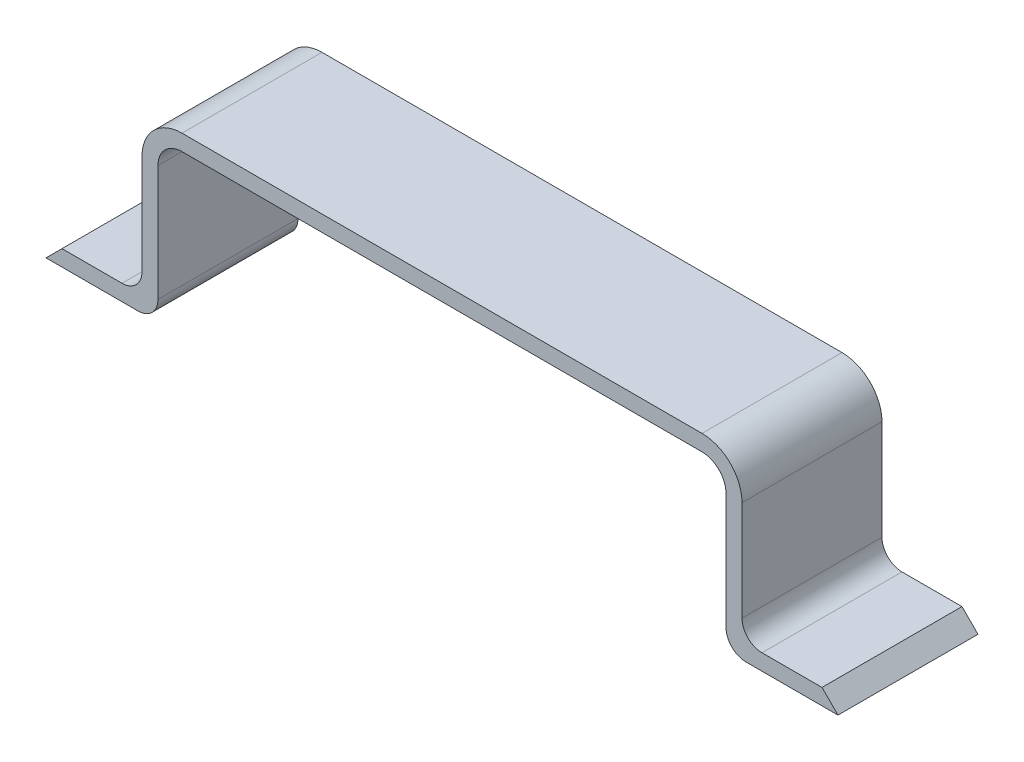
ISO-10303-21;
HEADER;
FILE_DESCRIPTION(('STEP AP214'),'2;1');
FILE_NAME('part.step','',(''),(''),'','','');
FILE_SCHEMA(('AUTOMOTIVE_DESIGN { 1 0 10303 214 1 1 1 1 }'));
ENDSEC;
DATA;
#1=APPLICATION_CONTEXT('core data for automotive mechanical design processes');
#2=APPLICATION_PROTOCOL_DEFINITION('international standard','automotive_design',2000,#1);
#3=PRODUCT_CONTEXT('',#1,'mechanical');
#4=PRODUCT('Part','Part','',(#3));
#5=PRODUCT_RELATED_PRODUCT_CATEGORY('part','',(#4));
#6=PRODUCT_DEFINITION_FORMATION('','',#4);
#7=PRODUCT_DEFINITION_CONTEXT('part definition',#1,'design');
#8=PRODUCT_DEFINITION('design','',#6,#7);
#9=PRODUCT_DEFINITION_SHAPE('','',#8);
#10=(LENGTH_UNIT() NAMED_UNIT(*) SI_UNIT(.MILLI.,.METRE.));
#11=(NAMED_UNIT(*) PLANE_ANGLE_UNIT() SI_UNIT($,.RADIAN.));
#12=(NAMED_UNIT(*) SI_UNIT($,.STERADIAN.) SOLID_ANGLE_UNIT());
#13=UNCERTAINTY_MEASURE_WITH_UNIT(LENGTH_MEASURE(1.E-05),#10,'distance_accuracy_value','');
#14=(GEOMETRIC_REPRESENTATION_CONTEXT(3) GLOBAL_UNCERTAINTY_ASSIGNED_CONTEXT((#13)) GLOBAL_UNIT_ASSIGNED_CONTEXT((#10,
#11,#12)) REPRESENTATION_CONTEXT('',''));
#15=CARTESIAN_POINT('',(0.,0.,0.));
#16=DIRECTION('',(0.,0.,1.));
#17=DIRECTION('',(1.,0.,0.));
#18=AXIS2_PLACEMENT_3D('',#15,#16,#17);
#19=CARTESIAN_POINT('',(-100.,-4.,17.5));
#20=DIRECTION('',(0.,1.,0.));
#21=DIRECTION('',(0.,0.,1.));
#22=AXIS2_PLACEMENT_3D('',#19,#20,#21);
#23=PLANE('',#22);
#24=DIRECTION('',(1.,0.,0.));
#25=VECTOR('',#24,1.);
#26=CARTESIAN_POINT('',(-100.,-4.,17.5));
#27=LINE('',#26,#25);
#28=CARTESIAN_POINT('',(-98.9999999999999,-4.,17.5));
#29=VERTEX_POINT('',#28);
#30=CARTESIAN_POINT('',(-76.,-4.,17.5));
#31=VERTEX_POINT('',#30);
#32=EDGE_CURVE('E170',#29,#31,#27,.T.);
#33=ORIENTED_EDGE('',*,*,#32,.F.);
#34=DIRECTION('',(0.,0.,1.));
#35=VECTOR('',#34,1.);
#36=CARTESIAN_POINT('',(-98.9999999999999,-4.,17.5));
#37=LINE('',#36,#35);
#38=CARTESIAN_POINT('',(-98.9999999999999,-4.,-17.5));
#39=VERTEX_POINT('',#38);
#40=EDGE_CURVE('E188',#29,#39,#37,.F.);
#41=ORIENTED_EDGE('',*,*,#40,.T.);
#42=DIRECTION('',(1.,0.,0.));
#43=VECTOR('',#42,1.);
#44=CARTESIAN_POINT('',(-100.,-4.,-17.5));
#45=LINE('',#44,#43);
#46=CARTESIAN_POINT('',(-76.,-4.,-17.5));
#47=VERTEX_POINT('',#46);
#48=EDGE_CURVE('E185',#39,#47,#45,.T.);
#49=ORIENTED_EDGE('',*,*,#48,.T.);
#50=DIRECTION('',(0.,0.,-1.));
#51=VECTOR('',#50,1.);
#52=CARTESIAN_POINT('',(-76.,-4.,17.5));
#53=LINE('',#52,#51);
#54=EDGE_CURVE('E183',#31,#47,#53,.T.);
#55=ORIENTED_EDGE('',*,*,#54,.F.);
#56=EDGE_LOOP('',(#33,#41,#49,#55));
#57=FACE_BOUND('',#56,.T.);
#58=ADVANCED_FACE('F34',(#57),#23,.F.);
#59=CARTESIAN_POINT('',(-76.,0.999999999999999,17.5));
#60=DIRECTION('',(0.,0.,-1.));
#61=DIRECTION('',(-1.,0.,0.));
#62=AXIS2_PLACEMENT_3D('',#59,#60,#61);
#63=CYLINDRICAL_SURFACE('',#62,5.);
#64=CARTESIAN_POINT('',(-76.,0.999999999999999,-17.5));
#65=DIRECTION('',(0.,0.,1.));
#66=DIRECTION('',(1.,0.,0.));
#67=AXIS2_PLACEMENT_3D('',#64,#65,#66);
#68=CIRCLE('',#67,5.);
#69=CARTESIAN_POINT('',(-71.,1.00000000000004,-17.5));
#70=VERTEX_POINT('',#69);
#71=EDGE_CURVE('E230',#47,#70,#68,.T.);
#72=ORIENTED_EDGE('',*,*,#71,.T.);
#73=DIRECTION('',(0.,0.,-1.));
#74=VECTOR('',#73,1.);
#75=CARTESIAN_POINT('',(-71.,1.00000000000004,17.5));
#76=LINE('',#75,#74);
#77=CARTESIAN_POINT('',(-71.,1.00000000000004,17.5));
#78=VERTEX_POINT('',#77);
#79=EDGE_CURVE('E189',#78,#70,#76,.T.);
#80=ORIENTED_EDGE('',*,*,#79,.F.);
#81=CARTESIAN_POINT('',(-76.,0.999999999999999,17.5));
#82=DIRECTION('',(0.,0.,1.));
#83=DIRECTION('',(1.,0.,0.));
#84=AXIS2_PLACEMENT_3D('',#81,#82,#83);
#85=CIRCLE('',#84,5.);
#86=EDGE_CURVE('E175',#31,#78,#85,.T.);
#87=ORIENTED_EDGE('',*,*,#86,.F.);
#88=ORIENTED_EDGE('',*,*,#54,.T.);
#89=EDGE_LOOP('',(#72,#80,#87,#88));
#90=FACE_BOUND('',#89,.T.);
#91=ADVANCED_FACE('F191',(#90),#63,.T.);
#92=CARTESIAN_POINT('',(-71.,1.00000000000004,17.5));
#93=DIRECTION('',(-1.,0.,0.));
#94=DIRECTION('',(0.,0.,1.));
#95=AXIS2_PLACEMENT_3D('',#92,#93,#94);
#96=PLANE('',#95);
#97=DIRECTION('',(0.,1.,0.));
#98=VECTOR('',#97,1.);
#99=CARTESIAN_POINT('',(-71.,1.00000000000004,-17.5));
#100=LINE('',#99,#98);
#101=CARTESIAN_POINT('',(-71.,29.9999999999999,-17.5));
#102=VERTEX_POINT('',#101);
#103=EDGE_CURVE('E232',#70,#102,#100,.T.);
#104=ORIENTED_EDGE('',*,*,#103,.T.);
#105=DIRECTION('',(0.,0.,-1.));
#106=VECTOR('',#105,1.);
#107=CARTESIAN_POINT('',(-71.,29.9999999999999,17.5));
#108=LINE('',#107,#106);
#109=CARTESIAN_POINT('',(-71.,29.9999999999999,17.5));
#110=VERTEX_POINT('',#109);
#111=EDGE_CURVE('E302',#110,#102,#108,.T.);
#112=ORIENTED_EDGE('',*,*,#111,.F.);
#113=DIRECTION('',(0.,1.,0.));
#114=VECTOR('',#113,1.);
#115=CARTESIAN_POINT('',(-71.,1.00000000000004,17.5));
#116=LINE('',#115,#114);
#117=EDGE_CURVE('E194',#78,#110,#116,.T.);
#118=ORIENTED_EDGE('',*,*,#117,.F.);
#119=ORIENTED_EDGE('',*,*,#79,.T.);
#120=EDGE_LOOP('',(#104,#112,#118,#119));
#121=FACE_BOUND('',#120,.T.);
#122=ADVANCED_FACE('F371',(#121),#96,.F.);
#123=CARTESIAN_POINT('',(-65.,30.,17.5));
#124=DIRECTION('',(0.,0.,-1.));
#125=DIRECTION('',(-1.,0.,0.));
#126=AXIS2_PLACEMENT_3D('',#123,#124,#125);
#127=CYLINDRICAL_SURFACE('',#126,5.99999999999999);
#128=CARTESIAN_POINT('',(-65.,30.,-17.5));
#129=DIRECTION('',(0.,0.,-1.));
#130=DIRECTION('',(-1.,0.,0.));
#131=AXIS2_PLACEMENT_3D('',#128,#129,#130);
#132=CIRCLE('',#131,5.99999999999999);
#133=CARTESIAN_POINT('',(-65.,36.,-17.5));
#134=VERTEX_POINT('',#133);
#135=EDGE_CURVE('E234',#102,#134,#132,.T.);
#136=ORIENTED_EDGE('',*,*,#135,.T.);
#137=DIRECTION('',(0.,0.,-1.));
#138=VECTOR('',#137,1.);
#139=CARTESIAN_POINT('',(-65.,36.,17.5));
#140=LINE('',#139,#138);
#141=CARTESIAN_POINT('',(-65.,36.,17.5));
#142=VERTEX_POINT('',#141);
#143=EDGE_CURVE('E299',#142,#134,#140,.T.);
#144=ORIENTED_EDGE('',*,*,#143,.F.);
#145=CARTESIAN_POINT('',(-65.,30.,17.5));
#146=DIRECTION('',(0.,0.,-1.));
#147=DIRECTION('',(-1.,0.,0.));
#148=AXIS2_PLACEMENT_3D('',#145,#146,#147);
#149=CIRCLE('',#148,5.99999999999999);
#150=EDGE_CURVE('E196',#110,#142,#149,.T.);
#151=ORIENTED_EDGE('',*,*,#150,.F.);
#152=ORIENTED_EDGE('',*,*,#111,.T.);
#153=EDGE_LOOP('',(#136,#144,#151,#152));
#154=FACE_BOUND('',#153,.T.);
#155=ADVANCED_FACE('F378',(#154),#127,.F.);
#156=CARTESIAN_POINT('',(-65.,36.,17.5));
#157=DIRECTION('',(0.,1.,0.));
#158=DIRECTION('',(-1.,0.,0.));
#159=AXIS2_PLACEMENT_3D('',#156,#157,#158);
#160=PLANE('',#159);
#161=DIRECTION('',(1.,0.,0.));
#162=VECTOR('',#161,1.);
#163=CARTESIAN_POINT('',(-65.,36.,-17.5));
#164=LINE('',#163,#162);
#165=CARTESIAN_POINT('',(64.9999999999999,36.,-17.5));
#166=VERTEX_POINT('',#165);
#167=EDGE_CURVE('E236',#134,#166,#164,.T.);
#168=ORIENTED_EDGE('',*,*,#167,.T.);
#169=DIRECTION('',(0.,0.,-1.));
#170=VECTOR('',#169,1.);
#171=CARTESIAN_POINT('',(64.9999999999999,36.,17.5));
#172=LINE('',#171,#170);
#173=CARTESIAN_POINT('',(64.9999999999999,36.,17.5));
#174=VERTEX_POINT('',#173);
#175=EDGE_CURVE('E296',#174,#166,#172,.T.);
#176=ORIENTED_EDGE('',*,*,#175,.F.);
#177=DIRECTION('',(1.,0.,0.));
#178=VECTOR('',#177,1.);
#179=CARTESIAN_POINT('',(-65.,36.,17.5));
#180=LINE('',#179,#178);
#181=EDGE_CURVE('E200',#142,#174,#180,.T.);
#182=ORIENTED_EDGE('',*,*,#181,.F.);
#183=ORIENTED_EDGE('',*,*,#143,.T.);
#184=EDGE_LOOP('',(#168,#176,#182,#183));
#185=FACE_BOUND('',#184,.T.);
#186=ADVANCED_FACE('F381',(#185),#160,.F.);
#187=CARTESIAN_POINT('',(65.,30.,17.5));
#188=DIRECTION('',(0.,0.,-1.));
#189=DIRECTION('',(-1.,0.,0.));
#190=AXIS2_PLACEMENT_3D('',#187,#188,#189);
#191=CYLINDRICAL_SURFACE('',#190,6.);
#192=CARTESIAN_POINT('',(65.,30.,-17.5));
#193=DIRECTION('',(0.,0.,-1.));
#194=DIRECTION('',(-1.,0.,0.));
#195=AXIS2_PLACEMENT_3D('',#192,#193,#194);
#196=CIRCLE('',#195,6.);
#197=CARTESIAN_POINT('',(71.,30.,-17.5));
#198=VERTEX_POINT('',#197);
#199=EDGE_CURVE('E238',#166,#198,#196,.T.);
#200=ORIENTED_EDGE('',*,*,#199,.T.);
#201=DIRECTION('',(0.,0.,-1.));
#202=VECTOR('',#201,1.);
#203=CARTESIAN_POINT('',(71.,30.,17.5));
#204=LINE('',#203,#202);
#205=CARTESIAN_POINT('',(71.,30.,17.5));
#206=VERTEX_POINT('',#205);
#207=EDGE_CURVE('E293',#206,#198,#204,.T.);
#208=ORIENTED_EDGE('',*,*,#207,.F.);
#209=CARTESIAN_POINT('',(65.,30.,17.5));
#210=DIRECTION('',(0.,0.,-1.));
#211=DIRECTION('',(-1.,0.,0.));
#212=AXIS2_PLACEMENT_3D('',#209,#210,#211);
#213=CIRCLE('',#212,6.);
#214=EDGE_CURVE('E202',#174,#206,#213,.T.);
#215=ORIENTED_EDGE('',*,*,#214,.F.);
#216=ORIENTED_EDGE('',*,*,#175,.T.);
#217=EDGE_LOOP('',(#200,#208,#215,#216));
#218=FACE_BOUND('',#217,.T.);
#219=ADVANCED_FACE('F386',(#218),#191,.F.);
#220=CARTESIAN_POINT('',(71.,30.,17.5));
#221=DIRECTION('',(1.,0.,0.));
#222=DIRECTION('',(0.,0.,-1.));
#223=AXIS2_PLACEMENT_3D('',#220,#221,#222);
#224=PLANE('',#223);
#225=DIRECTION('',(0.,-1.,0.));
#226=VECTOR('',#225,1.);
#227=CARTESIAN_POINT('',(71.,30.,-17.5));
#228=LINE('',#227,#226);
#229=CARTESIAN_POINT('',(71.,1.00000000000004,-17.5));
#230=VERTEX_POINT('',#229);
#231=EDGE_CURVE('E240',#198,#230,#228,.T.);
#232=ORIENTED_EDGE('',*,*,#231,.T.);
#233=DIRECTION('',(0.,0.,-1.));
#234=VECTOR('',#233,1.);
#235=CARTESIAN_POINT('',(71.,1.00000000000004,17.5));
#236=LINE('',#235,#234);
#237=CARTESIAN_POINT('',(71.,1.00000000000004,17.5));
#238=VERTEX_POINT('',#237);
#239=EDGE_CURVE('E290',#238,#230,#236,.T.);
#240=ORIENTED_EDGE('',*,*,#239,.F.);
#241=DIRECTION('',(0.,-1.,0.));
#242=VECTOR('',#241,1.);
#243=CARTESIAN_POINT('',(71.,30.,17.5));
#244=LINE('',#243,#242);
#245=EDGE_CURVE('E204',#206,#238,#244,.T.);
#246=ORIENTED_EDGE('',*,*,#245,.F.);
#247=ORIENTED_EDGE('',*,*,#207,.T.);
#248=EDGE_LOOP('',(#232,#240,#246,#247));
#249=FACE_BOUND('',#248,.T.);
#250=ADVANCED_FACE('F392',(#249),#224,.F.);
#251=CARTESIAN_POINT('',(76.,0.999999999999999,17.5));
#252=DIRECTION('',(0.,0.,-1.));
#253=DIRECTION('',(-1.,0.,0.));
#254=AXIS2_PLACEMENT_3D('',#251,#252,#253);
#255=CYLINDRICAL_SURFACE('',#254,5.);
#256=CARTESIAN_POINT('',(76.,0.999999999999999,-17.5));
#257=DIRECTION('',(0.,0.,1.));
#258=DIRECTION('',(1.,0.,0.));
#259=AXIS2_PLACEMENT_3D('',#256,#257,#258);
#260=CIRCLE('',#259,5.);
#261=CARTESIAN_POINT('',(76.,-4.,-17.5));
#262=VERTEX_POINT('',#261);
#263=EDGE_CURVE('E242',#230,#262,#260,.T.);
#264=ORIENTED_EDGE('',*,*,#263,.T.);
#265=DIRECTION('',(0.,0.,-1.));
#266=VECTOR('',#265,1.);
#267=CARTESIAN_POINT('',(76.,-4.,17.5));
#268=LINE('',#267,#266);
#269=CARTESIAN_POINT('',(76.,-4.,17.5));
#270=VERTEX_POINT('',#269);
#271=EDGE_CURVE('E287',#270,#262,#268,.T.);
#272=ORIENTED_EDGE('',*,*,#271,.F.);
#273=CARTESIAN_POINT('',(76.,0.999999999999999,17.5));
#274=DIRECTION('',(0.,0.,1.));
#275=DIRECTION('',(1.,0.,0.));
#276=AXIS2_PLACEMENT_3D('',#273,#274,#275);
#277=CIRCLE('',#276,5.);
#278=EDGE_CURVE('E206',#238,#270,#277,.T.);
#279=ORIENTED_EDGE('',*,*,#278,.F.);
#280=ORIENTED_EDGE('',*,*,#239,.T.);
#281=EDGE_LOOP('',(#264,#272,#279,#280));
#282=FACE_BOUND('',#281,.T.);
#283=ADVANCED_FACE('F396',(#282),#255,.T.);
#284=CARTESIAN_POINT('',(76.,-4.,17.5));
#285=DIRECTION('',(0.,1.,0.));
#286=DIRECTION('',(0.,0.,1.));
#287=AXIS2_PLACEMENT_3D('',#284,#285,#286);
#288=PLANE('',#287);
#289=DIRECTION('',(1.,0.,0.));
#290=VECTOR('',#289,1.);
#291=CARTESIAN_POINT('',(76.,-4.,-17.5));
#292=LINE('',#291,#290);
#293=CARTESIAN_POINT('',(99.,-4.,-17.5));
#294=VERTEX_POINT('',#293);
#295=EDGE_CURVE('E244',#262,#294,#292,.T.);
#296=ORIENTED_EDGE('',*,*,#295,.T.);
#297=DIRECTION('',(0.,0.,-1.));
#298=VECTOR('',#297,1.);
#299=CARTESIAN_POINT('',(99.,-4.,17.5));
#300=LINE('',#299,#298);
#301=CARTESIAN_POINT('',(99.,-4.,17.5));
#302=VERTEX_POINT('',#301);
#303=EDGE_CURVE('E11',#294,#302,#300,.F.);
#304=ORIENTED_EDGE('',*,*,#303,.T.);
#305=DIRECTION('',(1.,0.,0.));
#306=VECTOR('',#305,1.);
#307=CARTESIAN_POINT('',(76.,-4.,17.5));
#308=LINE('',#307,#306);
#309=EDGE_CURVE('E208',#270,#302,#308,.T.);
#310=ORIENTED_EDGE('',*,*,#309,.F.);
#311=ORIENTED_EDGE('',*,*,#271,.T.);
#312=EDGE_LOOP('',(#296,#304,#310,#311));
#313=FACE_BOUND('',#312,.T.);
#314=ADVANCED_FACE('F397',(#313),#288,.F.);
#315=CARTESIAN_POINT('',(80.,0.,17.5));
#316=DIRECTION('',(0.,-1.,0.));
#317=DIRECTION('',(0.,0.,-1.));
#318=AXIS2_PLACEMENT_3D('',#315,#316,#317);
#319=PLANE('',#318);
#320=DIRECTION('',(-1.,0.,0.));
#321=VECTOR('',#320,1.);
#322=CARTESIAN_POINT('',(80.,0.,17.5));
#323=LINE('',#322,#321);
#324=CARTESIAN_POINT('',(94.9999999999999,0.,17.5));
#325=VERTEX_POINT('',#324);
#326=CARTESIAN_POINT('',(80.,0.,17.5));
#327=VERTEX_POINT('',#326);
#328=EDGE_CURVE('E210',#325,#327,#323,.T.);
#329=ORIENTED_EDGE('',*,*,#328,.F.);
#330=DIRECTION('',(0.,0.,-1.));
#331=VECTOR('',#330,1.);
#332=CARTESIAN_POINT('',(94.9999999999999,0.,17.5));
#333=LINE('',#332,#331);
#334=CARTESIAN_POINT('',(94.9999999999999,0.,-17.5));
#335=VERTEX_POINT('',#334);
#336=EDGE_CURVE('E43',#325,#335,#333,.T.);
#337=ORIENTED_EDGE('',*,*,#336,.T.);
#338=DIRECTION('',(-1.,0.,0.));
#339=VECTOR('',#338,1.);
#340=CARTESIAN_POINT('',(80.,0.,-17.5));
#341=LINE('',#340,#339);
#342=CARTESIAN_POINT('',(80.,0.,-17.5));
#343=VERTEX_POINT('',#342);
#344=EDGE_CURVE('E246',#335,#343,#341,.T.);
#345=ORIENTED_EDGE('',*,*,#344,.T.);
#346=DIRECTION('',(0.,0.,-1.));
#347=VECTOR('',#346,1.);
#348=CARTESIAN_POINT('',(80.,0.,17.5));
#349=LINE('',#348,#347);
#350=EDGE_CURVE('E284',#327,#343,#349,.T.);
#351=ORIENTED_EDGE('',*,*,#350,.F.);
#352=EDGE_LOOP('',(#329,#337,#345,#351));
#353=FACE_BOUND('',#352,.T.);
#354=ADVANCED_FACE('F319',(#353),#319,.F.);
#355=CARTESIAN_POINT('',(80.,5.,17.5));
#356=DIRECTION('',(0.,0.,-1.));
#357=DIRECTION('',(-1.,0.,0.));
#358=AXIS2_PLACEMENT_3D('',#355,#356,#357);
#359=CYLINDRICAL_SURFACE('',#358,5.);
#360=CARTESIAN_POINT('',(80.,5.,-17.5));
#361=DIRECTION('',(0.,0.,-1.));
#362=DIRECTION('',(1.,0.,0.));
#363=AXIS2_PLACEMENT_3D('',#360,#361,#362);
#364=CIRCLE('',#363,5.);
#365=CARTESIAN_POINT('',(75.,5.00000000000004,-17.5));
#366=VERTEX_POINT('',#365);
#367=EDGE_CURVE('E248',#343,#366,#364,.T.);
#368=ORIENTED_EDGE('',*,*,#367,.T.);
#369=DIRECTION('',(0.,0.,-1.));
#370=VECTOR('',#369,1.);
#371=CARTESIAN_POINT('',(75.,5.00000000000004,17.5));
#372=LINE('',#371,#370);
#373=CARTESIAN_POINT('',(75.,5.00000000000004,17.5));
#374=VERTEX_POINT('',#373);
#375=EDGE_CURVE('E281',#374,#366,#372,.T.);
#376=ORIENTED_EDGE('',*,*,#375,.F.);
#377=CARTESIAN_POINT('',(80.,5.,17.5));
#378=DIRECTION('',(0.,0.,-1.));
#379=DIRECTION('',(1.,0.,0.));
#380=AXIS2_PLACEMENT_3D('',#377,#378,#379);
#381=CIRCLE('',#380,5.);
#382=EDGE_CURVE('E212',#327,#374,#381,.T.);
#383=ORIENTED_EDGE('',*,*,#382,.F.);
#384=ORIENTED_EDGE('',*,*,#350,.T.);
#385=EDGE_LOOP('',(#368,#376,#383,#384));
#386=FACE_BOUND('',#385,.T.);
#387=ADVANCED_FACE('F330',(#386),#359,.F.);
#388=CARTESIAN_POINT('',(75.,29.9999999999999,17.5));
#389=DIRECTION('',(-1.,0.,0.));
#390=DIRECTION('',(0.,0.,1.));
#391=AXIS2_PLACEMENT_3D('',#388,#389,#390);
#392=PLANE('',#391);
#393=DIRECTION('',(0.,1.,0.));
#394=VECTOR('',#393,1.);
#395=CARTESIAN_POINT('',(75.,29.9999999999999,-17.5));
#396=LINE('',#395,#394);
#397=CARTESIAN_POINT('',(75.,29.9999999999999,-17.5));
#398=VERTEX_POINT('',#397);
#399=EDGE_CURVE('E250',#366,#398,#396,.T.);
#400=ORIENTED_EDGE('',*,*,#399,.T.);
#401=DIRECTION('',(0.,0.,-1.));
#402=VECTOR('',#401,1.);
#403=CARTESIAN_POINT('',(75.,29.9999999999999,17.5));
#404=LINE('',#403,#402);
#405=CARTESIAN_POINT('',(75.,29.9999999999999,17.5));
#406=VERTEX_POINT('',#405);
#407=EDGE_CURVE('E278',#406,#398,#404,.T.);
#408=ORIENTED_EDGE('',*,*,#407,.F.);
#409=DIRECTION('',(0.,1.,0.));
#410=VECTOR('',#409,1.);
#411=CARTESIAN_POINT('',(75.,29.9999999999999,17.5));
#412=LINE('',#411,#410);
#413=EDGE_CURVE('E214',#374,#406,#412,.T.);
#414=ORIENTED_EDGE('',*,*,#413,.F.);
#415=ORIENTED_EDGE('',*,*,#375,.T.);
#416=EDGE_LOOP('',(#400,#408,#414,#415));
#417=FACE_BOUND('',#416,.T.);
#418=ADVANCED_FACE('F334',(#417),#392,.F.);
#419=CARTESIAN_POINT('',(65.,30.,17.5));
#420=DIRECTION('',(0.,0.,-1.));
#421=DIRECTION('',(-1.,0.,0.));
#422=AXIS2_PLACEMENT_3D('',#419,#420,#421);
#423=CYLINDRICAL_SURFACE('',#422,10.);
#424=CARTESIAN_POINT('',(65.,30.,-17.5));
#425=DIRECTION('',(0.,0.,1.));
#426=DIRECTION('',(-1.,0.,0.));
#427=AXIS2_PLACEMENT_3D('',#424,#425,#426);
#428=CIRCLE('',#427,10.);
#429=CARTESIAN_POINT('',(64.9999999999999,40.,-17.5));
#430=VERTEX_POINT('',#429);
#431=EDGE_CURVE('E252',#398,#430,#428,.T.);
#432=ORIENTED_EDGE('',*,*,#431,.T.);
#433=DIRECTION('',(0.,0.,-1.));
#434=VECTOR('',#433,1.);
#435=CARTESIAN_POINT('',(64.9999999999999,40.,17.5));
#436=LINE('',#435,#434);
#437=CARTESIAN_POINT('',(64.9999999999999,40.,17.5));
#438=VERTEX_POINT('',#437);
#439=EDGE_CURVE('E275',#438,#430,#436,.T.);
#440=ORIENTED_EDGE('',*,*,#439,.F.);
#441=CARTESIAN_POINT('',(65.,30.,17.5));
#442=DIRECTION('',(0.,0.,1.));
#443=DIRECTION('',(-1.,0.,0.));
#444=AXIS2_PLACEMENT_3D('',#441,#442,#443);
#445=CIRCLE('',#444,10.);
#446=EDGE_CURVE('E216',#406,#438,#445,.T.);
#447=ORIENTED_EDGE('',*,*,#446,.F.);
#448=ORIENTED_EDGE('',*,*,#407,.T.);
#449=EDGE_LOOP('',(#432,#440,#447,#448));
#450=FACE_BOUND('',#449,.T.);
#451=ADVANCED_FACE('F341',(#450),#423,.T.);
#452=CARTESIAN_POINT('',(-64.9999999999999,40.,17.5));
#453=DIRECTION('',(0.,-1.,0.));
#454=DIRECTION('',(0.,0.,-1.));
#455=AXIS2_PLACEMENT_3D('',#452,#453,#454);
#456=PLANE('',#455);
#457=DIRECTION('',(-1.,0.,0.));
#458=VECTOR('',#457,1.);
#459=CARTESIAN_POINT('',(-64.9999999999999,40.,-17.5));
#460=LINE('',#459,#458);
#461=CARTESIAN_POINT('',(-64.9999999999999,40.,-17.5));
#462=VERTEX_POINT('',#461);
#463=EDGE_CURVE('E254',#430,#462,#460,.T.);
#464=ORIENTED_EDGE('',*,*,#463,.T.);
#465=DIRECTION('',(0.,0.,-1.));
#466=VECTOR('',#465,1.);
#467=CARTESIAN_POINT('',(-64.9999999999999,40.,17.5));
#468=LINE('',#467,#466);
#469=CARTESIAN_POINT('',(-64.9999999999999,40.,17.5));
#470=VERTEX_POINT('',#469);
#471=EDGE_CURVE('E272',#470,#462,#468,.T.);
#472=ORIENTED_EDGE('',*,*,#471,.F.);
#473=DIRECTION('',(-1.,0.,0.));
#474=VECTOR('',#473,1.);
#475=CARTESIAN_POINT('',(-64.9999999999999,40.,17.5));
#476=LINE('',#475,#474);
#477=EDGE_CURVE('E218',#438,#470,#476,.T.);
#478=ORIENTED_EDGE('',*,*,#477,.F.);
#479=ORIENTED_EDGE('',*,*,#439,.T.);
#480=EDGE_LOOP('',(#464,#472,#478,#479));
#481=FACE_BOUND('',#480,.T.);
#482=ADVANCED_FACE('F344',(#481),#456,.F.);
#483=CARTESIAN_POINT('',(-65.,30.,17.5));
#484=DIRECTION('',(0.,0.,-1.));
#485=DIRECTION('',(-1.,0.,0.));
#486=AXIS2_PLACEMENT_3D('',#483,#484,#485);
#487=CYLINDRICAL_SURFACE('',#486,10.);
#488=CARTESIAN_POINT('',(-65.,30.,-17.5));
#489=DIRECTION('',(0.,0.,1.));
#490=DIRECTION('',(-1.,0.,0.));
#491=AXIS2_PLACEMENT_3D('',#488,#489,#490);
#492=CIRCLE('',#491,10.);
#493=CARTESIAN_POINT('',(-75.,29.9999999999999,-17.5));
#494=VERTEX_POINT('',#493);
#495=EDGE_CURVE('E256',#462,#494,#492,.T.);
#496=ORIENTED_EDGE('',*,*,#495,.T.);
#497=DIRECTION('',(0.,0.,-1.));
#498=VECTOR('',#497,1.);
#499=CARTESIAN_POINT('',(-75.,29.9999999999999,17.5));
#500=LINE('',#499,#498);
#501=CARTESIAN_POINT('',(-75.,29.9999999999999,17.5));
#502=VERTEX_POINT('',#501);
#503=EDGE_CURVE('E269',#502,#494,#500,.T.);
#504=ORIENTED_EDGE('',*,*,#503,.F.);
#505=CARTESIAN_POINT('',(-65.,30.,17.5));
#506=DIRECTION('',(0.,0.,1.));
#507=DIRECTION('',(-1.,0.,0.));
#508=AXIS2_PLACEMENT_3D('',#505,#506,#507);
#509=CIRCLE('',#508,10.);
#510=EDGE_CURVE('E220',#470,#502,#509,.T.);
#511=ORIENTED_EDGE('',*,*,#510,.F.);
#512=ORIENTED_EDGE('',*,*,#471,.T.);
#513=EDGE_LOOP('',(#496,#504,#511,#512));
#514=FACE_BOUND('',#513,.T.);
#515=ADVANCED_FACE('F349',(#514),#487,.T.);
#516=CARTESIAN_POINT('',(-75.,5.00000000000004,17.5));
#517=DIRECTION('',(1.,0.,0.));
#518=DIRECTION('',(0.,0.,-1.));
#519=AXIS2_PLACEMENT_3D('',#516,#517,#518);
#520=PLANE('',#519);
#521=DIRECTION('',(0.,-1.,0.));
#522=VECTOR('',#521,1.);
#523=CARTESIAN_POINT('',(-75.,5.00000000000004,-17.5));
#524=LINE('',#523,#522);
#525=CARTESIAN_POINT('',(-75.,5.,-17.5));
#526=VERTEX_POINT('',#525);
#527=EDGE_CURVE('E258',#494,#526,#524,.T.);
#528=ORIENTED_EDGE('',*,*,#527,.T.);
#529=DIRECTION('',(0.,0.,-1.));
#530=VECTOR('',#529,1.);
#531=CARTESIAN_POINT('',(-75.,5.,17.5));
#532=LINE('',#531,#530);
#533=CARTESIAN_POINT('',(-75.,5.,17.5));
#534=VERTEX_POINT('',#533);
#535=EDGE_CURVE('E266',#534,#526,#532,.T.);
#536=ORIENTED_EDGE('',*,*,#535,.F.);
#537=DIRECTION('',(0.,-1.,0.));
#538=VECTOR('',#537,1.);
#539=CARTESIAN_POINT('',(-75.,5.00000000000004,17.5));
#540=LINE('',#539,#538);
#541=EDGE_CURVE('E222',#502,#534,#540,.T.);
#542=ORIENTED_EDGE('',*,*,#541,.F.);
#543=ORIENTED_EDGE('',*,*,#503,.T.);
#544=EDGE_LOOP('',(#528,#536,#542,#543));
#545=FACE_BOUND('',#544,.T.);
#546=ADVANCED_FACE('F355',(#545),#520,.F.);
#547=CARTESIAN_POINT('',(-80.,5.,17.5));
#548=DIRECTION('',(0.,0.,-1.));
#549=DIRECTION('',(-1.,0.,0.));
#550=AXIS2_PLACEMENT_3D('',#547,#548,#549);
#551=CYLINDRICAL_SURFACE('',#550,5.);
#552=CARTESIAN_POINT('',(-80.,5.,-17.5));
#553=DIRECTION('',(0.,0.,-1.));
#554=DIRECTION('',(1.,0.,0.));
#555=AXIS2_PLACEMENT_3D('',#552,#553,#554);
#556=CIRCLE('',#555,5.);
#557=CARTESIAN_POINT('',(-80.,0.,-17.5));
#558=VERTEX_POINT('',#557);
#559=EDGE_CURVE('E260',#526,#558,#556,.T.);
#560=ORIENTED_EDGE('',*,*,#559,.T.);
#561=DIRECTION('',(0.,0.,-1.));
#562=VECTOR('',#561,1.);
#563=CARTESIAN_POINT('',(-80.,0.,17.5));
#564=LINE('',#563,#562);
#565=CARTESIAN_POINT('',(-80.,0.,17.5));
#566=VERTEX_POINT('',#565);
#567=EDGE_CURVE('E228',#566,#558,#564,.T.);
#568=ORIENTED_EDGE('',*,*,#567,.F.);
#569=CARTESIAN_POINT('',(-80.,5.,17.5));
#570=DIRECTION('',(0.,0.,-1.));
#571=DIRECTION('',(1.,0.,0.));
#572=AXIS2_PLACEMENT_3D('',#569,#570,#571);
#573=CIRCLE('',#572,5.);
#574=EDGE_CURVE('E224',#534,#566,#573,.T.);
#575=ORIENTED_EDGE('',*,*,#574,.F.);
#576=ORIENTED_EDGE('',*,*,#535,.T.);
#577=EDGE_LOOP('',(#560,#568,#575,#576));
#578=FACE_BOUND('',#577,.T.);
#579=ADVANCED_FACE('F359',(#578),#551,.F.);
#580=CARTESIAN_POINT('',(-100.,0.,17.5));
#581=DIRECTION('',(0.,-1.,0.));
#582=DIRECTION('',(0.,0.,-1.));
#583=AXIS2_PLACEMENT_3D('',#580,#581,#582);
#584=PLANE('',#583);
#585=DIRECTION('',(-1.,0.,0.));
#586=VECTOR('',#585,1.);
#587=CARTESIAN_POINT('',(-100.,0.,-17.5));
#588=LINE('',#587,#586);
#589=CARTESIAN_POINT('',(-95.,0.,-17.5));
#590=VERTEX_POINT('',#589);
#591=EDGE_CURVE('E180',#558,#590,#588,.T.);
#592=ORIENTED_EDGE('',*,*,#591,.T.);
#593=DIRECTION('',(0.,0.,1.));
#594=VECTOR('',#593,1.);
#595=CARTESIAN_POINT('',(-95.,0.,17.5));
#596=LINE('',#595,#594);
#597=CARTESIAN_POINT('',(-95.,0.,17.5));
#598=VERTEX_POINT('',#597);
#599=EDGE_CURVE('E311',#590,#598,#596,.T.);
#600=ORIENTED_EDGE('',*,*,#599,.T.);
#601=DIRECTION('',(-1.,0.,0.));
#602=VECTOR('',#601,1.);
#603=CARTESIAN_POINT('',(-100.,0.,17.5));
#604=LINE('',#603,#602);
#605=EDGE_CURVE('E226',#566,#598,#604,.T.);
#606=ORIENTED_EDGE('',*,*,#605,.F.);
#607=ORIENTED_EDGE('',*,*,#567,.T.);
#608=EDGE_LOOP('',(#592,#600,#606,#607));
#609=FACE_BOUND('',#608,.T.);
#610=ADVANCED_FACE('F363',(#609),#584,.F.);
#611=CARTESIAN_POINT('',(-76.,0.999999999999999,17.5));
#612=DIRECTION('',(0.,0.,1.));
#613=DIRECTION('',(1.,0.,0.));
#614=AXIS2_PLACEMENT_3D('',#611,#612,#613);
#615=PLANE('',#614);
#616=ORIENTED_EDGE('',*,*,#605,.T.);
#617=DIRECTION('',(0.707106781186544,0.707106781186551,0.));
#618=VECTOR('',#617,1.);
#619=CARTESIAN_POINT('',(-85.0000000000001,9.99999999999999,17.5));
#620=LINE('',#619,#618);
#621=EDGE_CURVE('E177',#598,#29,#620,.F.);
#622=ORIENTED_EDGE('',*,*,#621,.T.);
#623=ORIENTED_EDGE('',*,*,#32,.T.);
#624=ORIENTED_EDGE('',*,*,#86,.T.);
#625=ORIENTED_EDGE('',*,*,#117,.T.);
#626=ORIENTED_EDGE('',*,*,#150,.T.);
#627=ORIENTED_EDGE('',*,*,#181,.T.);
#628=ORIENTED_EDGE('',*,*,#214,.T.);
#629=ORIENTED_EDGE('',*,*,#245,.T.);
#630=ORIENTED_EDGE('',*,*,#278,.T.);
#631=ORIENTED_EDGE('',*,*,#309,.T.);
#632=DIRECTION('',(0.707106781186551,-0.707106781186544,0.));
#633=VECTOR('',#632,1.);
#634=CARTESIAN_POINT('',(8.99999999999906,86.,17.5));
#635=LINE('',#634,#633);
#636=EDGE_CURVE('E50',#302,#325,#635,.F.);
#637=ORIENTED_EDGE('',*,*,#636,.T.);
#638=ORIENTED_EDGE('',*,*,#328,.T.);
#639=ORIENTED_EDGE('',*,*,#382,.T.);
#640=ORIENTED_EDGE('',*,*,#413,.T.);
#641=ORIENTED_EDGE('',*,*,#446,.T.);
#642=ORIENTED_EDGE('',*,*,#477,.T.);
#643=ORIENTED_EDGE('',*,*,#510,.T.);
#644=ORIENTED_EDGE('',*,*,#541,.T.);
#645=ORIENTED_EDGE('',*,*,#574,.T.);
#646=EDGE_LOOP('',(#616,#622,#623,#624,#625,#626,#627,#628,#629,#630,#631,#637,#638,#639,#640,
#641,#642,#643,#644,#645));
#647=FACE_BOUND('',#646,.T.);
#648=ADVANCED_FACE('F173',(#647),#615,.T.);
#649=CARTESIAN_POINT('',(-76.,0.999999999999999,-17.5));
#650=DIRECTION('',(0.,0.,1.));
#651=DIRECTION('',(1.,0.,0.));
#652=AXIS2_PLACEMENT_3D('',#649,#650,#651);
#653=PLANE('',#652);
#654=ORIENTED_EDGE('',*,*,#48,.F.);
#655=DIRECTION('',(-0.707106781186544,-0.707106781186551,0.));
#656=VECTOR('',#655,1.);
#657=CARTESIAN_POINT('',(-100.,-5.00000000000009,-17.5));
#658=LINE('',#657,#656);
#659=EDGE_CURVE('E309',#39,#590,#658,.F.);
#660=ORIENTED_EDGE('',*,*,#659,.T.);
#661=ORIENTED_EDGE('',*,*,#591,.F.);
#662=ORIENTED_EDGE('',*,*,#559,.F.);
#663=ORIENTED_EDGE('',*,*,#527,.F.);
#664=ORIENTED_EDGE('',*,*,#495,.F.);
#665=ORIENTED_EDGE('',*,*,#463,.F.);
#666=ORIENTED_EDGE('',*,*,#431,.F.);
#667=ORIENTED_EDGE('',*,*,#399,.F.);
#668=ORIENTED_EDGE('',*,*,#367,.F.);
#669=ORIENTED_EDGE('',*,*,#344,.F.);
#670=DIRECTION('',(-0.707106781186551,0.707106781186544,0.));
#671=VECTOR('',#670,1.);
#672=CARTESIAN_POINT('',(94.9999999999999,0.,-17.5));
#673=LINE('',#672,#671);
#674=EDGE_CURVE('E307',#335,#294,#673,.F.);
#675=ORIENTED_EDGE('',*,*,#674,.T.);
#676=ORIENTED_EDGE('',*,*,#295,.F.);
#677=ORIENTED_EDGE('',*,*,#263,.F.);
#678=ORIENTED_EDGE('',*,*,#231,.F.);
#679=ORIENTED_EDGE('',*,*,#199,.F.);
#680=ORIENTED_EDGE('',*,*,#167,.F.);
#681=ORIENTED_EDGE('',*,*,#135,.F.);
#682=ORIENTED_EDGE('',*,*,#103,.F.);
#683=ORIENTED_EDGE('',*,*,#71,.F.);
#684=EDGE_LOOP('',(#654,#660,#661,#662,#663,#664,#665,#666,#667,#668,#669,#675,#676,#677,#678,
#679,#680,#681,#682,#683));
#685=FACE_BOUND('',#684,.T.);
#686=ADVANCED_FACE('F324',(#685),#653,.F.);
#687=CARTESIAN_POINT('',(-100.,-5.00000000000009,17.5));
#688=DIRECTION('',(0.707106781186551,-0.707106781186544,0.));
#689=DIRECTION('',(0.,0.,-1.));
#690=AXIS2_PLACEMENT_3D('',#687,#688,#689);
#691=PLANE('',#690);
#692=ORIENTED_EDGE('',*,*,#621,.F.);
#693=ORIENTED_EDGE('',*,*,#599,.F.);
#694=ORIENTED_EDGE('',*,*,#659,.F.);
#695=ORIENTED_EDGE('',*,*,#40,.F.);
#696=EDGE_LOOP('',(#692,#693,#694,#695));
#697=FACE_BOUND('',#696,.T.);
#698=ADVANCED_FACE('F367',(#697),#691,.F.);
#699=CARTESIAN_POINT('',(94.9999999999999,0.,17.5));
#700=DIRECTION('',(-0.707106781186544,-0.707106781186551,0.));
#701=DIRECTION('',(0.,0.,-1.));
#702=AXIS2_PLACEMENT_3D('',#699,#700,#701);
#703=PLANE('',#702);
#704=ORIENTED_EDGE('',*,*,#636,.F.);
#705=ORIENTED_EDGE('',*,*,#303,.F.);
#706=ORIENTED_EDGE('',*,*,#674,.F.);
#707=ORIENTED_EDGE('',*,*,#336,.F.);
#708=EDGE_LOOP('',(#704,#705,#706,#707));
#709=FACE_BOUND('',#708,.T.);
#710=ADVANCED_FACE('F37',(#709),#703,.F.);
#711=CLOSED_SHELL('',(#58,#91,#122,#155,#186,#219,#250,#283,#314,#354,#387,#418,#451,#482,#515,
#546,#579,#610,#648,#686,#698,#710));
#712=MANIFOLD_SOLID_BREP('B2',#711);
#713=ADVANCED_BREP_SHAPE_REPRESENTATION('',(#18,#712),#14);
#714=SHAPE_DEFINITION_REPRESENTATION(#9,#713);
ENDSEC;
END-ISO-10303-21;
